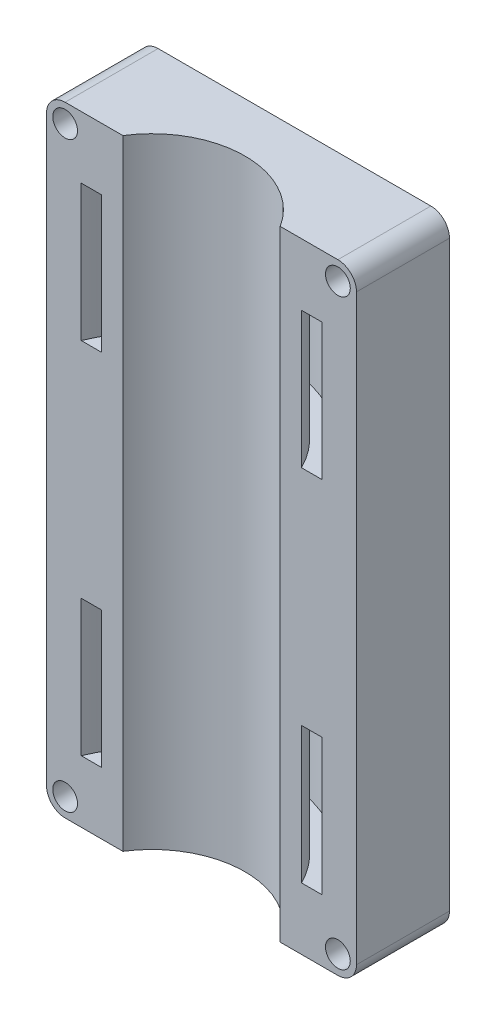
ISO-10303-21;
HEADER;
FILE_DESCRIPTION(('STEP AP214'),'2;1');
FILE_NAME('part.step','',(''),(''),'','','');
FILE_SCHEMA(('AUTOMOTIVE_DESIGN { 1 0 10303 214 1 1 1 1 }'));
ENDSEC;
DATA;
#1=APPLICATION_CONTEXT('core data for automotive mechanical design processes');
#2=APPLICATION_PROTOCOL_DEFINITION('international standard','automotive_design',2000,#1);
#3=PRODUCT_CONTEXT('',#1,'mechanical');
#4=PRODUCT('Part','Part','',(#3));
#5=PRODUCT_RELATED_PRODUCT_CATEGORY('part','',(#4));
#6=PRODUCT_DEFINITION_FORMATION('','',#4);
#7=PRODUCT_DEFINITION_CONTEXT('part definition',#1,'design');
#8=PRODUCT_DEFINITION('design','',#6,#7);
#9=PRODUCT_DEFINITION_SHAPE('','',#8);
#10=(LENGTH_UNIT() NAMED_UNIT(*) SI_UNIT(.MILLI.,.METRE.));
#11=(NAMED_UNIT(*) PLANE_ANGLE_UNIT() SI_UNIT($,.RADIAN.));
#12=(NAMED_UNIT(*) SI_UNIT($,.STERADIAN.) SOLID_ANGLE_UNIT());
#13=UNCERTAINTY_MEASURE_WITH_UNIT(LENGTH_MEASURE(1.E-05),#10,'distance_accuracy_value','');
#14=(GEOMETRIC_REPRESENTATION_CONTEXT(3) GLOBAL_UNCERTAINTY_ASSIGNED_CONTEXT((#13)) GLOBAL_UNIT_ASSIGNED_CONTEXT((#10,
#11,#12)) REPRESENTATION_CONTEXT('',''));
#15=CARTESIAN_POINT('',(0.,0.,0.));
#16=DIRECTION('',(0.,0.,1.));
#17=DIRECTION('',(1.,0.,0.));
#18=AXIS2_PLACEMENT_3D('',#15,#16,#17);
#19=CARTESIAN_POINT('',(21.9929702359002,-47.0002235739537,15.));
#20=DIRECTION('',(0.,0.,1.));
#21=DIRECTION('',(1.,0.,0.));
#22=AXIS2_PLACEMENT_3D('',#19,#20,#21);
#23=PLANE('',#22);
#24=DIRECTION('',(0.,1.,0.));
#25=VECTOR('',#24,1.);
#26=CARTESIAN_POINT('',(12.6885775404495,-50.0002235739537,15.));
#27=LINE('',#26,#25);
#28=CARTESIAN_POINT('',(12.6885775404495,-50.0002235739537,15.));
#29=VERTEX_POINT('',#28);
#30=CARTESIAN_POINT('',(12.6885775404495,49.9997764260463,15.));
#31=VERTEX_POINT('',#30);
#32=EDGE_CURVE('E333',#29,#31,#27,.T.);
#33=ORIENTED_EDGE('',*,*,#32,.F.);
#34=DIRECTION('',(1.,0.,0.));
#35=VECTOR('',#34,1.);
#36=CARTESIAN_POINT('',(-22.0070297640998,-50.0002235739537,15.));
#37=LINE('',#36,#35);
#38=CARTESIAN_POINT('',(21.9929702359002,-50.0002235739537,15.));
#39=VERTEX_POINT('',#38);
#40=EDGE_CURVE('E386',#29,#39,#37,.T.);
#41=ORIENTED_EDGE('',*,*,#40,.T.);
#42=CARTESIAN_POINT('',(21.9929702359002,-47.0002235739537,15.));
#43=DIRECTION('',(0.,0.,1.));
#44=DIRECTION('',(1.,0.,0.));
#45=AXIS2_PLACEMENT_3D('',#42,#43,#44);
#46=CIRCLE('',#45,3.00000000000001);
#47=CARTESIAN_POINT('',(24.9929702359002,-47.0002235739537,15.));
#48=VERTEX_POINT('',#47);
#49=EDGE_CURVE('E364',#39,#48,#46,.T.);
#50=ORIENTED_EDGE('',*,*,#49,.T.);
#51=DIRECTION('',(0.,1.,0.));
#52=VECTOR('',#51,1.);
#53=CARTESIAN_POINT('',(24.9929702359002,-47.0002235739537,15.));
#54=LINE('',#53,#52);
#55=CARTESIAN_POINT('',(24.9929702359002,46.9997764260463,15.));
#56=VERTEX_POINT('',#55);
#57=EDGE_CURVE('E367',#48,#56,#54,.T.);
#58=ORIENTED_EDGE('',*,*,#57,.T.);
#59=CARTESIAN_POINT('',(21.9929702359002,46.9997764260463,15.));
#60=DIRECTION('',(0.,0.,-1.));
#61=DIRECTION('',(-1.,0.,0.));
#62=AXIS2_PLACEMENT_3D('',#59,#60,#61);
#63=CIRCLE('',#62,3.);
#64=CARTESIAN_POINT('',(21.9929702359002,49.9997764260463,15.));
#65=VERTEX_POINT('',#64);
#66=EDGE_CURVE('E370',#65,#56,#63,.T.);
#67=ORIENTED_EDGE('',*,*,#66,.F.);
#68=DIRECTION('',(1.,0.,0.));
#69=VECTOR('',#68,1.);
#70=CARTESIAN_POINT('',(-22.0070297640998,49.9997764260463,15.));
#71=LINE('',#70,#69);
#72=EDGE_CURVE('E373',#31,#65,#71,.T.);
#73=ORIENTED_EDGE('',*,*,#72,.F.);
#74=EDGE_LOOP('',(#33,#41,#50,#58,#67,#73));
#75=FACE_BOUND('',#74,.T.);
#76=CARTESIAN_POINT('',(21.9929702359002,46.9997764260463,15.));
#77=DIRECTION('',(0.,0.,1.));
#78=DIRECTION('',(1.,0.,0.));
#79=AXIS2_PLACEMENT_3D('',#76,#77,#78);
#80=CIRCLE('',#79,2.00000000000001);
#81=CARTESIAN_POINT('',(23.9929702359002,46.9997764260463,15.));
#82=VERTEX_POINT('',#81);
#83=EDGE_CURVE('E358',#82,#82,#80,.T.);
#84=ORIENTED_EDGE('',*,*,#83,.F.);
#85=EDGE_LOOP('',(#84));
#86=FACE_BOUND('',#85,.T.);
#87=CARTESIAN_POINT('',(21.9929702359002,-47.0002235739537,15.));
#88=DIRECTION('',(0.,0.,1.));
#89=DIRECTION('',(1.,0.,0.));
#90=AXIS2_PLACEMENT_3D('',#87,#88,#89);
#91=CIRCLE('',#90,2.00000000000001);
#92=CARTESIAN_POINT('',(23.9929702359002,-47.0002235739537,15.));
#93=VERTEX_POINT('',#92);
#94=EDGE_CURVE('E346',#93,#93,#91,.T.);
#95=ORIENTED_EDGE('',*,*,#94,.F.);
#96=EDGE_LOOP('',(#95));
#97=FACE_BOUND('',#96,.T.);
#98=DIRECTION('',(0.,1.,0.));
#99=VECTOR('',#98,1.);
#100=CARTESIAN_POINT('',(19.4164878389476,17.9997764260463,15.));
#101=LINE('',#100,#99);
#102=CARTESIAN_POINT('',(19.4164878389476,17.9997764260463,15.));
#103=VERTEX_POINT('',#102);
#104=CARTESIAN_POINT('',(19.4164878389476,39.9997764260463,15.));
#105=VERTEX_POINT('',#104);
#106=EDGE_CURVE('E308',#103,#105,#101,.T.);
#107=ORIENTED_EDGE('',*,*,#106,.F.);
#108=DIRECTION('',(1.,0.,0.));
#109=VECTOR('',#108,1.);
#110=CARTESIAN_POINT('',(0.,17.9997764260463,15.));
#111=LINE('',#110,#109);
#112=CARTESIAN_POINT('',(16.1245154965971,17.9997764260463,15.));
#113=VERTEX_POINT('',#112);
#114=EDGE_CURVE('E298',#113,#103,#111,.T.);
#115=ORIENTED_EDGE('',*,*,#114,.F.);
#116=DIRECTION('',(0.,1.,0.));
#117=VECTOR('',#116,1.);
#118=CARTESIAN_POINT('',(16.1245154965971,17.9997764260463,15.));
#119=LINE('',#118,#117);
#120=CARTESIAN_POINT('',(16.1245154965971,39.9997764260463,15.));
#121=VERTEX_POINT('',#120);
#122=EDGE_CURVE('E318',#113,#121,#119,.T.);
#123=ORIENTED_EDGE('',*,*,#122,.T.);
#124=DIRECTION('',(1.,0.,0.));
#125=VECTOR('',#124,1.);
#126=CARTESIAN_POINT('',(0.,39.9997764260463,15.));
#127=LINE('',#126,#125);
#128=EDGE_CURVE('E309',#121,#105,#127,.T.);
#129=ORIENTED_EDGE('',*,*,#128,.T.);
#130=EDGE_LOOP('',(#107,#115,#123,#129));
#131=FACE_BOUND('',#130,.T.);
#132=DIRECTION('',(0.,1.,0.));
#133=VECTOR('',#132,1.);
#134=CARTESIAN_POINT('',(19.4164878389476,-40.0002235739537,15.));
#135=LINE('',#134,#133);
#136=CARTESIAN_POINT('',(19.4164878389476,-40.0002235739537,15.));
#137=VERTEX_POINT('',#136);
#138=CARTESIAN_POINT('',(19.4164878389476,-18.0002235739537,15.));
#139=VERTEX_POINT('',#138);
#140=EDGE_CURVE('E274',#137,#139,#135,.T.);
#141=ORIENTED_EDGE('',*,*,#140,.F.);
#142=DIRECTION('',(1.,0.,0.));
#143=VECTOR('',#142,1.);
#144=CARTESIAN_POINT('',(0.,-40.0002235739537,15.));
#145=LINE('',#144,#143);
#146=CARTESIAN_POINT('',(16.1245154965971,-40.0002235739537,15.));
#147=VERTEX_POINT('',#146);
#148=EDGE_CURVE('E282',#147,#137,#145,.T.);
#149=ORIENTED_EDGE('',*,*,#148,.F.);
#150=DIRECTION('',(0.,1.,0.));
#151=VECTOR('',#150,1.);
#152=CARTESIAN_POINT('',(16.1245154965971,-40.0002235739537,15.));
#153=LINE('',#152,#151);
#154=CARTESIAN_POINT('',(16.1245154965971,-18.0002235739537,15.));
#155=VERTEX_POINT('',#154);
#156=EDGE_CURVE('E313',#147,#155,#153,.T.);
#157=ORIENTED_EDGE('',*,*,#156,.T.);
#158=DIRECTION('',(1.,0.,0.));
#159=VECTOR('',#158,1.);
#160=CARTESIAN_POINT('',(0.,-18.0002235739537,15.));
#161=LINE('',#160,#159);
#162=EDGE_CURVE('E291',#155,#139,#161,.T.);
#163=ORIENTED_EDGE('',*,*,#162,.T.);
#164=EDGE_LOOP('',(#141,#149,#157,#163));
#165=FACE_BOUND('',#164,.T.);
#166=ADVANCED_FACE('F147',(#75,#86,#97,#131,#165),#23,.T.);
#167=DIRECTION('',(0.,1.,0.));
#168=VECTOR('',#167,1.);
#169=CARTESIAN_POINT('',(-12.6885775404495,-50.0002235739537,15.));
#170=LINE('',#169,#168);
#171=CARTESIAN_POINT('',(-12.6885775404495,-50.0002235739537,15.));
#172=VERTEX_POINT('',#171);
#173=CARTESIAN_POINT('',(-12.6885775404495,49.9997764260463,15.));
#174=VERTEX_POINT('',#173);
#175=EDGE_CURVE('E335',#172,#174,#170,.T.);
#176=ORIENTED_EDGE('',*,*,#175,.T.);
#177=CARTESIAN_POINT('',(-22.0070297640998,49.9997764260463,15.));
#178=VERTEX_POINT('',#177);
#179=EDGE_CURVE('E374',#178,#174,#71,.T.);
#180=ORIENTED_EDGE('',*,*,#179,.F.);
#181=CARTESIAN_POINT('',(-22.0070297640998,46.9997764260463,15.));
#182=DIRECTION('',(0.,0.,-1.));
#183=DIRECTION('',(-1.,0.,0.));
#184=AXIS2_PLACEMENT_3D('',#181,#182,#183);
#185=CIRCLE('',#184,3.);
#186=CARTESIAN_POINT('',(-25.0070297640998,46.9997764260463,15.));
#187=VERTEX_POINT('',#186);
#188=EDGE_CURVE('E377',#187,#178,#185,.T.);
#189=ORIENTED_EDGE('',*,*,#188,.F.);
#190=DIRECTION('',(0.,1.,0.));
#191=VECTOR('',#190,1.);
#192=CARTESIAN_POINT('',(-25.0070297640998,-47.0002235739537,15.));
#193=LINE('',#192,#191);
#194=CARTESIAN_POINT('',(-25.0070297640998,-47.0002235739537,15.));
#195=VERTEX_POINT('',#194);
#196=EDGE_CURVE('E380',#195,#187,#193,.T.);
#197=ORIENTED_EDGE('',*,*,#196,.F.);
#198=CARTESIAN_POINT('',(-22.0070297640998,-47.0002235739537,15.));
#199=DIRECTION('',(0.,0.,-1.));
#200=DIRECTION('',(-1.,0.,0.));
#201=AXIS2_PLACEMENT_3D('',#198,#199,#200);
#202=CIRCLE('',#201,3.);
#203=CARTESIAN_POINT('',(-22.0070297640998,-50.0002235739537,15.));
#204=VERTEX_POINT('',#203);
#205=EDGE_CURVE('E383',#204,#195,#202,.T.);
#206=ORIENTED_EDGE('',*,*,#205,.F.);
#207=EDGE_CURVE('E387',#204,#172,#37,.T.);
#208=ORIENTED_EDGE('',*,*,#207,.T.);
#209=EDGE_LOOP('',(#176,#180,#189,#197,#206,#208));
#210=FACE_BOUND('',#209,.T.);
#211=CARTESIAN_POINT('',(-22.0070297640998,46.9997764260463,15.));
#212=DIRECTION('',(0.,0.,1.));
#213=DIRECTION('',(1.,0.,0.));
#214=AXIS2_PLACEMENT_3D('',#211,#212,#213);
#215=CIRCLE('',#214,2.);
#216=CARTESIAN_POINT('',(-20.0070297640998,46.9997764260463,15.));
#217=VERTEX_POINT('',#216);
#218=EDGE_CURVE('E352',#217,#217,#215,.T.);
#219=ORIENTED_EDGE('',*,*,#218,.F.);
#220=EDGE_LOOP('',(#219));
#221=FACE_BOUND('',#220,.T.);
#222=CARTESIAN_POINT('',(-22.0070297640998,-47.0002235739537,15.));
#223=DIRECTION('',(0.,0.,1.));
#224=DIRECTION('',(1.,0.,0.));
#225=AXIS2_PLACEMENT_3D('',#222,#223,#224);
#226=CIRCLE('',#225,2.);
#227=CARTESIAN_POINT('',(-20.0070297640998,-47.0002235739537,15.));
#228=VERTEX_POINT('',#227);
#229=EDGE_CURVE('E340',#228,#228,#226,.T.);
#230=ORIENTED_EDGE('',*,*,#229,.F.);
#231=EDGE_LOOP('',(#230));
#232=FACE_BOUND('',#231,.T.);
#233=DIRECTION('',(0.,1.,0.));
#234=VECTOR('',#233,1.);
#235=CARTESIAN_POINT('',(-16.1245154965971,17.9997764260463,15.));
#236=LINE('',#235,#234);
#237=CARTESIAN_POINT('',(-16.1245154965971,17.9997764260463,15.));
#238=VERTEX_POINT('',#237);
#239=CARTESIAN_POINT('',(-16.1245154965971,39.9997764260463,15.));
#240=VERTEX_POINT('',#239);
#241=EDGE_CURVE('E322',#238,#240,#236,.T.);
#242=ORIENTED_EDGE('',*,*,#241,.F.);
#243=CARTESIAN_POINT('',(-19.4164878389476,17.9997764260463,15.));
#244=VERTEX_POINT('',#243);
#245=EDGE_CURVE('E303',#244,#238,#111,.T.);
#246=ORIENTED_EDGE('',*,*,#245,.F.);
#247=DIRECTION('',(0.,1.,0.));
#248=VECTOR('',#247,1.);
#249=CARTESIAN_POINT('',(-19.4164878389476,17.9997764260463,15.));
#250=LINE('',#249,#248);
#251=CARTESIAN_POINT('',(-19.4164878389476,39.9997764260463,15.));
#252=VERTEX_POINT('',#251);
#253=EDGE_CURVE('E325',#244,#252,#250,.T.);
#254=ORIENTED_EDGE('',*,*,#253,.T.);
#255=EDGE_CURVE('E314',#252,#240,#127,.T.);
#256=ORIENTED_EDGE('',*,*,#255,.T.);
#257=EDGE_LOOP('',(#242,#246,#254,#256));
#258=FACE_BOUND('',#257,.T.);
#259=DIRECTION('',(0.,1.,0.));
#260=VECTOR('',#259,1.);
#261=CARTESIAN_POINT('',(-16.1245154965971,-40.0002235739537,15.));
#262=LINE('',#261,#260);
#263=CARTESIAN_POINT('',(-16.1245154965971,-40.0002235739537,15.));
#264=VERTEX_POINT('',#263);
#265=CARTESIAN_POINT('',(-16.1245154965971,-18.0002235739537,15.));
#266=VERTEX_POINT('',#265);
#267=EDGE_CURVE('E293',#264,#266,#262,.T.);
#268=ORIENTED_EDGE('',*,*,#267,.F.);
#269=CARTESIAN_POINT('',(-19.4164878389476,-40.0002235739537,15.));
#270=VERTEX_POINT('',#269);
#271=EDGE_CURVE('E281',#270,#264,#145,.T.);
#272=ORIENTED_EDGE('',*,*,#271,.F.);
#273=DIRECTION('',(0.,1.,0.));
#274=VECTOR('',#273,1.);
#275=CARTESIAN_POINT('',(-19.4164878389476,-40.0002235739537,15.));
#276=LINE('',#275,#274);
#277=CARTESIAN_POINT('',(-19.4164878389476,-18.0002235739537,15.));
#278=VERTEX_POINT('',#277);
#279=EDGE_CURVE('E277',#270,#278,#276,.T.);
#280=ORIENTED_EDGE('',*,*,#279,.T.);
#281=EDGE_CURVE('E702',#278,#266,#161,.T.);
#282=ORIENTED_EDGE('',*,*,#281,.T.);
#283=EDGE_LOOP('',(#268,#272,#280,#282));
#284=FACE_BOUND('',#283,.T.);
#285=ADVANCED_FACE('F465',(#210,#221,#232,#258,#284),#23,.T.);
#286=CARTESIAN_POINT('',(21.9929702359002,-47.0002235739537,0.));
#287=DIRECTION('',(0.,0.,1.));
#288=DIRECTION('',(1.,0.,0.));
#289=AXIS2_PLACEMENT_3D('',#286,#287,#288);
#290=PLANE('',#289);
#291=CARTESIAN_POINT('',(21.9929702359002,-47.0002235739537,0.));
#292=DIRECTION('',(0.,0.,1.));
#293=DIRECTION('',(1.,0.,0.));
#294=AXIS2_PLACEMENT_3D('',#291,#292,#293);
#295=CIRCLE('',#294,3.00000000000001);
#296=CARTESIAN_POINT('',(21.9929702359002,-50.0002235739537,0.));
#297=VERTEX_POINT('',#296);
#298=CARTESIAN_POINT('',(24.9929702359002,-47.0002235739537,0.));
#299=VERTEX_POINT('',#298);
#300=EDGE_CURVE('E361',#297,#299,#295,.T.);
#301=ORIENTED_EDGE('',*,*,#300,.F.);
#302=DIRECTION('',(1.,0.,0.));
#303=VECTOR('',#302,1.);
#304=CARTESIAN_POINT('',(-22.0070297640998,-50.0002235739537,0.));
#305=LINE('',#304,#303);
#306=CARTESIAN_POINT('',(-22.0070297640998,-50.0002235739537,0.));
#307=VERTEX_POINT('',#306);
#308=EDGE_CURVE('E368',#307,#297,#305,.T.);
#309=ORIENTED_EDGE('',*,*,#308,.F.);
#310=CARTESIAN_POINT('',(-22.0070297640998,-47.0002235739537,0.));
#311=DIRECTION('',(0.,0.,-1.));
#312=DIRECTION('',(-1.,0.,0.));
#313=AXIS2_PLACEMENT_3D('',#310,#311,#312);
#314=CIRCLE('',#313,3.);
#315=CARTESIAN_POINT('',(-25.0070297640998,-47.0002235739537,0.));
#316=VERTEX_POINT('',#315);
#317=EDGE_CURVE('E408',#307,#316,#314,.T.);
#318=ORIENTED_EDGE('',*,*,#317,.T.);
#319=DIRECTION('',(0.,1.,0.));
#320=VECTOR('',#319,1.);
#321=CARTESIAN_POINT('',(-25.0070297640998,-47.0002235739537,0.));
#322=LINE('',#321,#320);
#323=CARTESIAN_POINT('',(-25.0070297640998,46.9997764260463,0.));
#324=VERTEX_POINT('',#323);
#325=EDGE_CURVE('E405',#316,#324,#322,.T.);
#326=ORIENTED_EDGE('',*,*,#325,.T.);
#327=CARTESIAN_POINT('',(-22.0070297640998,46.9997764260463,0.));
#328=DIRECTION('',(0.,0.,-1.));
#329=DIRECTION('',(-1.,0.,0.));
#330=AXIS2_PLACEMENT_3D('',#327,#328,#329);
#331=CIRCLE('',#330,3.);
#332=CARTESIAN_POINT('',(-22.0070297640998,49.9997764260463,0.));
#333=VERTEX_POINT('',#332);
#334=EDGE_CURVE('E402',#324,#333,#331,.T.);
#335=ORIENTED_EDGE('',*,*,#334,.T.);
#336=DIRECTION('',(1.,0.,0.));
#337=VECTOR('',#336,1.);
#338=CARTESIAN_POINT('',(-22.0070297640998,49.9997764260463,0.));
#339=LINE('',#338,#337);
#340=CARTESIAN_POINT('',(21.9929702359002,49.9997764260463,0.));
#341=VERTEX_POINT('',#340);
#342=EDGE_CURVE('E399',#333,#341,#339,.T.);
#343=ORIENTED_EDGE('',*,*,#342,.T.);
#344=CARTESIAN_POINT('',(21.9929702359002,46.9997764260463,0.));
#345=DIRECTION('',(0.,0.,-1.));
#346=DIRECTION('',(-1.,0.,0.));
#347=AXIS2_PLACEMENT_3D('',#344,#345,#346);
#348=CIRCLE('',#347,3.);
#349=CARTESIAN_POINT('',(24.9929702359002,46.9997764260463,0.));
#350=VERTEX_POINT('',#349);
#351=EDGE_CURVE('E396',#341,#350,#348,.T.);
#352=ORIENTED_EDGE('',*,*,#351,.T.);
#353=DIRECTION('',(0.,1.,0.));
#354=VECTOR('',#353,1.);
#355=CARTESIAN_POINT('',(24.9929702359002,-47.0002235739537,0.));
#356=LINE('',#355,#354);
#357=EDGE_CURVE('E393',#299,#350,#356,.T.);
#358=ORIENTED_EDGE('',*,*,#357,.F.);
#359=EDGE_LOOP('',(#301,#309,#318,#326,#335,#343,#352,#358));
#360=FACE_BOUND('',#359,.T.);
#361=CARTESIAN_POINT('',(21.9929702359002,46.9997764260463,0.));
#362=DIRECTION('',(0.,0.,1.));
#363=DIRECTION('',(1.,0.,0.));
#364=AXIS2_PLACEMENT_3D('',#361,#362,#363);
#365=CIRCLE('',#364,2.00000000000001);
#366=CARTESIAN_POINT('',(23.9929702359002,46.9997764260463,0.));
#367=VERTEX_POINT('',#366);
#368=EDGE_CURVE('E355',#367,#367,#365,.T.);
#369=ORIENTED_EDGE('',*,*,#368,.T.);
#370=EDGE_LOOP('',(#369));
#371=FACE_BOUND('',#370,.T.);
#372=CARTESIAN_POINT('',(-22.0070297640998,46.9997764260463,0.));
#373=DIRECTION('',(0.,0.,1.));
#374=DIRECTION('',(1.,0.,0.));
#375=AXIS2_PLACEMENT_3D('',#372,#373,#374);
#376=CIRCLE('',#375,2.);
#377=CARTESIAN_POINT('',(-20.0070297640998,46.9997764260463,0.));
#378=VERTEX_POINT('',#377);
#379=EDGE_CURVE('E349',#378,#378,#376,.T.);
#380=ORIENTED_EDGE('',*,*,#379,.T.);
#381=EDGE_LOOP('',(#380));
#382=FACE_BOUND('',#381,.T.);
#383=CARTESIAN_POINT('',(21.9929702359002,-47.0002235739537,0.));
#384=DIRECTION('',(0.,0.,1.));
#385=DIRECTION('',(1.,0.,0.));
#386=AXIS2_PLACEMENT_3D('',#383,#384,#385);
#387=CIRCLE('',#386,2.00000000000001);
#388=CARTESIAN_POINT('',(23.9929702359002,-47.0002235739537,0.));
#389=VERTEX_POINT('',#388);
#390=EDGE_CURVE('E343',#389,#389,#387,.T.);
#391=ORIENTED_EDGE('',*,*,#390,.T.);
#392=EDGE_LOOP('',(#391));
#393=FACE_BOUND('',#392,.T.);
#394=CARTESIAN_POINT('',(-22.0070297640998,-47.0002235739537,0.));
#395=DIRECTION('',(0.,0.,1.));
#396=DIRECTION('',(1.,0.,0.));
#397=AXIS2_PLACEMENT_3D('',#394,#395,#396);
#398=CIRCLE('',#397,2.);
#399=CARTESIAN_POINT('',(-20.0070297640998,-47.0002235739537,0.));
#400=VERTEX_POINT('',#399);
#401=EDGE_CURVE('E338',#400,#400,#398,.T.);
#402=ORIENTED_EDGE('',*,*,#401,.T.);
#403=EDGE_LOOP('',(#402));
#404=FACE_BOUND('',#403,.T.);
#405=ADVANCED_FACE('F434',(#360,#371,#382,#393,#404),#290,.F.);
#406=CARTESIAN_POINT('',(21.9929702359002,-47.0002235739537,15.));
#407=DIRECTION('',(0.,0.,-1.));
#408=DIRECTION('',(-1.,0.,0.));
#409=AXIS2_PLACEMENT_3D('',#406,#407,#408);
#410=CYLINDRICAL_SURFACE('',#409,3.00000000000001);
#411=ORIENTED_EDGE('',*,*,#300,.T.);
#412=DIRECTION('',(0.,0.,-1.));
#413=VECTOR('',#412,1.);
#414=CARTESIAN_POINT('',(24.9929702359002,-47.0002235739537,15.));
#415=LINE('',#414,#413);
#416=EDGE_CURVE('E12',#48,#299,#415,.T.);
#417=ORIENTED_EDGE('',*,*,#416,.F.);
#418=ORIENTED_EDGE('',*,*,#49,.F.);
#419=DIRECTION('',(0.,0.,-1.));
#420=VECTOR('',#419,1.);
#421=CARTESIAN_POINT('',(21.9929702359002,-50.0002235739537,15.));
#422=LINE('',#421,#420);
#423=EDGE_CURVE('E390',#39,#297,#422,.T.);
#424=ORIENTED_EDGE('',*,*,#423,.T.);
#425=EDGE_LOOP('',(#411,#417,#418,#424));
#426=FACE_BOUND('',#425,.T.);
#427=ADVANCED_FACE('F149',(#426),#410,.T.);
#428=CARTESIAN_POINT('',(24.9929702359002,-47.0002235739537,15.));
#429=DIRECTION('',(-1.,0.,0.));
#430=DIRECTION('',(0.,0.,1.));
#431=AXIS2_PLACEMENT_3D('',#428,#429,#430);
#432=PLANE('',#431);
#433=ORIENTED_EDGE('',*,*,#357,.T.);
#434=DIRECTION('',(0.,0.,-1.));
#435=VECTOR('',#434,1.);
#436=CARTESIAN_POINT('',(24.9929702359002,46.9997764260463,15.));
#437=LINE('',#436,#435);
#438=EDGE_CURVE('E155',#56,#350,#437,.T.);
#439=ORIENTED_EDGE('',*,*,#438,.F.);
#440=ORIENTED_EDGE('',*,*,#57,.F.);
#441=ORIENTED_EDGE('',*,*,#416,.T.);
#442=EDGE_LOOP('',(#433,#439,#440,#441));
#443=FACE_BOUND('',#442,.T.);
#444=ADVANCED_FACE('F430',(#443),#432,.F.);
#445=CARTESIAN_POINT('',(21.9929702359002,46.9997764260463,15.));
#446=DIRECTION('',(0.,0.,-1.));
#447=DIRECTION('',(-1.,0.,0.));
#448=AXIS2_PLACEMENT_3D('',#445,#446,#447);
#449=CYLINDRICAL_SURFACE('',#448,3.);
#450=ORIENTED_EDGE('',*,*,#351,.F.);
#451=DIRECTION('',(0.,0.,-1.));
#452=VECTOR('',#451,1.);
#453=CARTESIAN_POINT('',(21.9929702359002,49.9997764260463,15.));
#454=LINE('',#453,#452);
#455=EDGE_CURVE('E422',#65,#341,#454,.T.);
#456=ORIENTED_EDGE('',*,*,#455,.F.);
#457=ORIENTED_EDGE('',*,*,#66,.T.);
#458=ORIENTED_EDGE('',*,*,#438,.T.);
#459=EDGE_LOOP('',(#450,#456,#457,#458));
#460=FACE_BOUND('',#459,.T.);
#461=ADVANCED_FACE('F426',(#460),#449,.T.);
#462=CARTESIAN_POINT('',(-22.0070297640998,49.9997764260463,15.));
#463=DIRECTION('',(0.,1.,0.));
#464=DIRECTION('',(0.,0.,1.));
#465=AXIS2_PLACEMENT_3D('',#462,#463,#464);
#466=PLANE('',#465);
#467=CARTESIAN_POINT('',(0.,49.9997764260463,23.));
#468=DIRECTION('',(0.,1.,0.));
#469=DIRECTION('',(0.,0.,1.));
#470=AXIS2_PLACEMENT_3D('',#467,#468,#469);
#471=CIRCLE('',#470,15.);
#472=EDGE_CURVE('E321',#31,#174,#471,.T.);
#473=ORIENTED_EDGE('',*,*,#472,.F.);
#474=ORIENTED_EDGE('',*,*,#72,.T.);
#475=ORIENTED_EDGE('',*,*,#455,.T.);
#476=ORIENTED_EDGE('',*,*,#342,.F.);
#477=DIRECTION('',(0.,0.,-1.));
#478=VECTOR('',#477,1.);
#479=CARTESIAN_POINT('',(-22.0070297640998,49.9997764260463,15.));
#480=LINE('',#479,#478);
#481=EDGE_CURVE('E420',#178,#333,#480,.T.);
#482=ORIENTED_EDGE('',*,*,#481,.F.);
#483=ORIENTED_EDGE('',*,*,#179,.T.);
#484=EDGE_LOOP('',(#473,#474,#475,#476,#482,#483));
#485=FACE_BOUND('',#484,.T.);
#486=ADVANCED_FACE('F440',(#485),#466,.T.);
#487=CARTESIAN_POINT('',(-22.0070297640998,46.9997764260463,15.));
#488=DIRECTION('',(0.,0.,-1.));
#489=DIRECTION('',(-1.,0.,0.));
#490=AXIS2_PLACEMENT_3D('',#487,#488,#489);
#491=CYLINDRICAL_SURFACE('',#490,3.);
#492=ORIENTED_EDGE('',*,*,#334,.F.);
#493=DIRECTION('',(0.,0.,-1.));
#494=VECTOR('',#493,1.);
#495=CARTESIAN_POINT('',(-25.0070297640998,46.9997764260463,15.));
#496=LINE('',#495,#494);
#497=EDGE_CURVE('E418',#187,#324,#496,.T.);
#498=ORIENTED_EDGE('',*,*,#497,.F.);
#499=ORIENTED_EDGE('',*,*,#188,.T.);
#500=ORIENTED_EDGE('',*,*,#481,.T.);
#501=EDGE_LOOP('',(#492,#498,#499,#500));
#502=FACE_BOUND('',#501,.T.);
#503=ADVANCED_FACE('F463',(#502),#491,.T.);
#504=CARTESIAN_POINT('',(-25.0070297640998,-47.0002235739537,15.));
#505=DIRECTION('',(-1.,0.,0.));
#506=DIRECTION('',(0.,0.,1.));
#507=AXIS2_PLACEMENT_3D('',#504,#505,#506);
#508=PLANE('',#507);
#509=ORIENTED_EDGE('',*,*,#325,.F.);
#510=DIRECTION('',(0.,0.,-1.));
#511=VECTOR('',#510,1.);
#512=CARTESIAN_POINT('',(-25.0070297640998,-47.0002235739537,15.));
#513=LINE('',#512,#511);
#514=EDGE_CURVE('E416',#195,#316,#513,.T.);
#515=ORIENTED_EDGE('',*,*,#514,.F.);
#516=ORIENTED_EDGE('',*,*,#196,.T.);
#517=ORIENTED_EDGE('',*,*,#497,.T.);
#518=EDGE_LOOP('',(#509,#515,#516,#517));
#519=FACE_BOUND('',#518,.T.);
#520=ADVANCED_FACE('F460',(#519),#508,.T.);
#521=CARTESIAN_POINT('',(-22.0070297640998,-47.0002235739537,15.));
#522=DIRECTION('',(0.,0.,-1.));
#523=DIRECTION('',(-1.,0.,0.));
#524=AXIS2_PLACEMENT_3D('',#521,#522,#523);
#525=CYLINDRICAL_SURFACE('',#524,3.);
#526=ORIENTED_EDGE('',*,*,#317,.F.);
#527=DIRECTION('',(0.,0.,-1.));
#528=VECTOR('',#527,1.);
#529=CARTESIAN_POINT('',(-22.0070297640998,-50.0002235739537,15.));
#530=LINE('',#529,#528);
#531=EDGE_CURVE('E414',#204,#307,#530,.T.);
#532=ORIENTED_EDGE('',*,*,#531,.F.);
#533=ORIENTED_EDGE('',*,*,#205,.T.);
#534=ORIENTED_EDGE('',*,*,#514,.T.);
#535=EDGE_LOOP('',(#526,#532,#533,#534));
#536=FACE_BOUND('',#535,.T.);
#537=ADVANCED_FACE('F454',(#536),#525,.T.);
#538=CARTESIAN_POINT('',(-22.0070297640998,-50.0002235739537,15.));
#539=DIRECTION('',(0.,1.,0.));
#540=DIRECTION('',(-1.,0.,0.));
#541=AXIS2_PLACEMENT_3D('',#538,#539,#540);
#542=PLANE('',#541);
#543=ORIENTED_EDGE('',*,*,#40,.F.);
#544=CARTESIAN_POINT('',(0.,-50.0002235739537,23.));
#545=DIRECTION('',(0.,1.,0.));
#546=DIRECTION('',(0.,0.,1.));
#547=AXIS2_PLACEMENT_3D('',#544,#545,#546);
#548=CIRCLE('',#547,15.);
#549=EDGE_CURVE('E330',#29,#172,#548,.T.);
#550=ORIENTED_EDGE('',*,*,#549,.T.);
#551=ORIENTED_EDGE('',*,*,#207,.F.);
#552=ORIENTED_EDGE('',*,*,#531,.T.);
#553=ORIENTED_EDGE('',*,*,#308,.T.);
#554=ORIENTED_EDGE('',*,*,#423,.F.);
#555=EDGE_LOOP('',(#543,#550,#551,#552,#553,#554));
#556=FACE_BOUND('',#555,.T.);
#557=ADVANCED_FACE('F469',(#556),#542,.F.);
#558=CARTESIAN_POINT('',(21.9929702359002,46.9997764260463,15.));
#559=DIRECTION('',(0.,0.,-1.));
#560=DIRECTION('',(-1.,0.,0.));
#561=AXIS2_PLACEMENT_3D('',#558,#559,#560);
#562=CYLINDRICAL_SURFACE('',#561,2.00000000000001);
#563=ORIENTED_EDGE('',*,*,#83,.T.);
#564=EDGE_LOOP('',(#563));
#565=FACE_BOUND('',#564,.T.);
#566=ORIENTED_EDGE('',*,*,#368,.F.);
#567=EDGE_LOOP('',(#566));
#568=FACE_BOUND('',#567,.T.);
#569=ADVANCED_FACE('F471',(#565,#568),#562,.F.);
#570=CARTESIAN_POINT('',(-22.0070297640998,46.9997764260463,15.));
#571=DIRECTION('',(0.,0.,-1.));
#572=DIRECTION('',(-1.,0.,0.));
#573=AXIS2_PLACEMENT_3D('',#570,#571,#572);
#574=CYLINDRICAL_SURFACE('',#573,2.);
#575=ORIENTED_EDGE('',*,*,#218,.T.);
#576=EDGE_LOOP('',(#575));
#577=FACE_BOUND('',#576,.T.);
#578=ORIENTED_EDGE('',*,*,#379,.F.);
#579=EDGE_LOOP('',(#578));
#580=FACE_BOUND('',#579,.T.);
#581=ADVANCED_FACE('F478',(#577,#580),#574,.F.);
#582=CARTESIAN_POINT('',(21.9929702359002,-47.0002235739537,15.));
#583=DIRECTION('',(0.,0.,-1.));
#584=DIRECTION('',(-1.,0.,0.));
#585=AXIS2_PLACEMENT_3D('',#582,#583,#584);
#586=CYLINDRICAL_SURFACE('',#585,2.00000000000001);
#587=ORIENTED_EDGE('',*,*,#94,.T.);
#588=EDGE_LOOP('',(#587));
#589=FACE_BOUND('',#588,.T.);
#590=ORIENTED_EDGE('',*,*,#390,.F.);
#591=EDGE_LOOP('',(#590));
#592=FACE_BOUND('',#591,.T.);
#593=ADVANCED_FACE('F528',(#589,#592),#586,.F.);
#594=CARTESIAN_POINT('',(-22.0070297640998,-47.0002235739537,15.));
#595=DIRECTION('',(0.,0.,-1.));
#596=DIRECTION('',(-1.,0.,0.));
#597=AXIS2_PLACEMENT_3D('',#594,#595,#596);
#598=CYLINDRICAL_SURFACE('',#597,2.);
#599=ORIENTED_EDGE('',*,*,#229,.T.);
#600=EDGE_LOOP('',(#599));
#601=FACE_BOUND('',#600,.T.);
#602=ORIENTED_EDGE('',*,*,#401,.F.);
#603=EDGE_LOOP('',(#602));
#604=FACE_BOUND('',#603,.T.);
#605=ADVANCED_FACE('F536',(#601,#604),#598,.F.);
#606=CARTESIAN_POINT('',(0.,-50.0002235739537,23.));
#607=DIRECTION('',(0.,1.,0.));
#608=DIRECTION('',(0.,0.,1.));
#609=AXIS2_PLACEMENT_3D('',#606,#607,#608);
#610=CYLINDRICAL_SURFACE('',#609,15.);
#611=ORIENTED_EDGE('',*,*,#472,.T.);
#612=ORIENTED_EDGE('',*,*,#175,.F.);
#613=ORIENTED_EDGE('',*,*,#549,.F.);
#614=ORIENTED_EDGE('',*,*,#32,.T.);
#615=EDGE_LOOP('',(#611,#612,#613,#614));
#616=FACE_BOUND('',#615,.T.);
#617=ADVANCED_FACE('F468',(#616),#610,.F.);
#618=CARTESIAN_POINT('',(0.,17.9997764260463,23.));
#619=DIRECTION('',(0.,1.,0.));
#620=DIRECTION('',(0.,0.,1.));
#621=AXIS2_PLACEMENT_3D('',#618,#619,#620);
#622=CYLINDRICAL_SURFACE('',#621,18.);
#623=CARTESIAN_POINT('',(0.,39.9997764260463,23.));
#624=DIRECTION('',(0.,1.,0.));
#625=DIRECTION('',(0.,0.,1.));
#626=AXIS2_PLACEMENT_3D('',#623,#624,#625);
#627=CIRCLE('',#626,18.);
#628=EDGE_CURVE('E302',#121,#240,#627,.T.);
#629=ORIENTED_EDGE('',*,*,#628,.F.);
#630=ORIENTED_EDGE('',*,*,#122,.F.);
#631=CARTESIAN_POINT('',(0.,17.9997764260463,23.));
#632=DIRECTION('',(0.,1.,0.));
#633=DIRECTION('',(0.,0.,1.));
#634=AXIS2_PLACEMENT_3D('',#631,#632,#633);
#635=CIRCLE('',#634,18.);
#636=EDGE_CURVE('E306',#113,#238,#635,.T.);
#637=ORIENTED_EDGE('',*,*,#636,.T.);
#638=ORIENTED_EDGE('',*,*,#241,.T.);
#639=EDGE_LOOP('',(#629,#630,#637,#638));
#640=FACE_BOUND('',#639,.T.);
#641=ADVANCED_FACE('F577',(#640),#622,.T.);
#642=CARTESIAN_POINT('',(0.,17.9997764260463,23.));
#643=DIRECTION('',(0.,1.,0.));
#644=DIRECTION('',(0.,0.,1.));
#645=AXIS2_PLACEMENT_3D('',#642,#643,#644);
#646=CYLINDRICAL_SURFACE('',#645,21.);
#647=CARTESIAN_POINT('',(0.,39.9997764260463,23.));
#648=DIRECTION('',(0.,1.,0.));
#649=DIRECTION('',(0.,0.,1.));
#650=AXIS2_PLACEMENT_3D('',#647,#648,#649);
#651=CIRCLE('',#650,21.);
#652=EDGE_CURVE('E312',#105,#252,#651,.T.);
#653=ORIENTED_EDGE('',*,*,#652,.T.);
#654=ORIENTED_EDGE('',*,*,#253,.F.);
#655=CARTESIAN_POINT('',(0.,17.9997764260463,23.));
#656=DIRECTION('',(0.,1.,0.));
#657=DIRECTION('',(0.,0.,1.));
#658=AXIS2_PLACEMENT_3D('',#655,#656,#657);
#659=CIRCLE('',#658,21.);
#660=EDGE_CURVE('E301',#103,#244,#659,.T.);
#661=ORIENTED_EDGE('',*,*,#660,.F.);
#662=ORIENTED_EDGE('',*,*,#106,.T.);
#663=EDGE_LOOP('',(#653,#654,#661,#662));
#664=FACE_BOUND('',#663,.T.);
#665=ADVANCED_FACE('F585',(#664),#646,.F.);
#666=CARTESIAN_POINT('',(0.,17.9997764260463,0.));
#667=DIRECTION('',(0.,1.,0.));
#668=DIRECTION('',(0.,0.,1.));
#669=AXIS2_PLACEMENT_3D('',#666,#667,#668);
#670=PLANE('',#669);
#671=ORIENTED_EDGE('',*,*,#114,.T.);
#672=ORIENTED_EDGE('',*,*,#660,.T.);
#673=ORIENTED_EDGE('',*,*,#245,.T.);
#674=ORIENTED_EDGE('',*,*,#636,.F.);
#675=EDGE_LOOP('',(#671,#672,#673,#674));
#676=FACE_BOUND('',#675,.T.);
#677=ADVANCED_FACE('F594',(#676),#670,.T.);
#678=CARTESIAN_POINT('',(0.,39.9997764260463,0.));
#679=DIRECTION('',(0.,1.,0.));
#680=DIRECTION('',(0.,0.,1.));
#681=AXIS2_PLACEMENT_3D('',#678,#679,#680);
#682=PLANE('',#681);
#683=ORIENTED_EDGE('',*,*,#128,.F.);
#684=ORIENTED_EDGE('',*,*,#628,.T.);
#685=ORIENTED_EDGE('',*,*,#255,.F.);
#686=ORIENTED_EDGE('',*,*,#652,.F.);
#687=EDGE_LOOP('',(#683,#684,#685,#686));
#688=FACE_BOUND('',#687,.T.);
#689=ADVANCED_FACE('F603',(#688),#682,.F.);
#690=CARTESIAN_POINT('',(0.,-40.0002235739537,23.));
#691=DIRECTION('',(0.,1.,0.));
#692=DIRECTION('',(0.,0.,1.));
#693=AXIS2_PLACEMENT_3D('',#690,#691,#692);
#694=CYLINDRICAL_SURFACE('',#693,18.);
#695=CARTESIAN_POINT('',(0.,-18.0002235739537,23.));
#696=DIRECTION('',(0.,1.,0.));
#697=DIRECTION('',(0.,0.,1.));
#698=AXIS2_PLACEMENT_3D('',#695,#696,#697);
#699=CIRCLE('',#698,18.);
#700=EDGE_CURVE('E167',#155,#266,#699,.T.);
#701=ORIENTED_EDGE('',*,*,#700,.F.);
#702=ORIENTED_EDGE('',*,*,#156,.F.);
#703=CARTESIAN_POINT('',(0.,-40.0002235739537,23.));
#704=DIRECTION('',(0.,1.,0.));
#705=DIRECTION('',(0.,0.,1.));
#706=AXIS2_PLACEMENT_3D('',#703,#704,#705);
#707=CIRCLE('',#706,18.);
#708=EDGE_CURVE('E287',#147,#264,#707,.T.);
#709=ORIENTED_EDGE('',*,*,#708,.T.);
#710=ORIENTED_EDGE('',*,*,#267,.T.);
#711=EDGE_LOOP('',(#701,#702,#709,#710));
#712=FACE_BOUND('',#711,.T.);
#713=ADVANCED_FACE('F611',(#712),#694,.T.);
#714=CARTESIAN_POINT('',(0.,-40.0002235739537,23.));
#715=DIRECTION('',(0.,1.,0.));
#716=DIRECTION('',(0.,0.,1.));
#717=AXIS2_PLACEMENT_3D('',#714,#715,#716);
#718=CYLINDRICAL_SURFACE('',#717,21.);
#719=CARTESIAN_POINT('',(0.,-18.0002235739537,23.));
#720=DIRECTION('',(0.,1.,0.));
#721=DIRECTION('',(0.,0.,1.));
#722=AXIS2_PLACEMENT_3D('',#719,#720,#721);
#723=CIRCLE('',#722,21.);
#724=EDGE_CURVE('E162',#139,#278,#723,.T.);
#725=ORIENTED_EDGE('',*,*,#724,.T.);
#726=ORIENTED_EDGE('',*,*,#279,.F.);
#727=CARTESIAN_POINT('',(0.,-40.0002235739537,23.));
#728=DIRECTION('',(0.,1.,0.));
#729=DIRECTION('',(0.,0.,1.));
#730=AXIS2_PLACEMENT_3D('',#727,#728,#729);
#731=CIRCLE('',#730,21.);
#732=EDGE_CURVE('E270',#137,#270,#731,.T.);
#733=ORIENTED_EDGE('',*,*,#732,.F.);
#734=ORIENTED_EDGE('',*,*,#140,.T.);
#735=EDGE_LOOP('',(#725,#726,#733,#734));
#736=FACE_BOUND('',#735,.T.);
#737=ADVANCED_FACE('F272',(#736),#718,.F.);
#738=CARTESIAN_POINT('',(0.,-40.0002235739537,0.));
#739=DIRECTION('',(0.,1.,0.));
#740=DIRECTION('',(0.,0.,1.));
#741=AXIS2_PLACEMENT_3D('',#738,#739,#740);
#742=PLANE('',#741);
#743=ORIENTED_EDGE('',*,*,#148,.T.);
#744=ORIENTED_EDGE('',*,*,#732,.T.);
#745=ORIENTED_EDGE('',*,*,#271,.T.);
#746=ORIENTED_EDGE('',*,*,#708,.F.);
#747=EDGE_LOOP('',(#743,#744,#745,#746));
#748=FACE_BOUND('',#747,.T.);
#749=ADVANCED_FACE('F286',(#748),#742,.T.);
#750=CARTESIAN_POINT('',(0.,-18.0002235739537,0.));
#751=DIRECTION('',(0.,1.,0.));
#752=DIRECTION('',(0.,0.,1.));
#753=AXIS2_PLACEMENT_3D('',#750,#751,#752);
#754=PLANE('',#753);
#755=ORIENTED_EDGE('',*,*,#162,.F.);
#756=ORIENTED_EDGE('',*,*,#700,.T.);
#757=ORIENTED_EDGE('',*,*,#281,.F.);
#758=ORIENTED_EDGE('',*,*,#724,.F.);
#759=EDGE_LOOP('',(#755,#756,#757,#758));
#760=FACE_BOUND('',#759,.T.);
#761=ADVANCED_FACE('F646',(#760),#754,.F.);
#762=CLOSED_SHELL('',(#166,#285,#405,#427,#444,#461,#486,#503,#520,#537,#557,#569,#581,#593,
#605,#617,#641,#665,#677,#689,#713,#737,#749,#761));
#763=MANIFOLD_SOLID_BREP('B2',#762);
#764=ADVANCED_BREP_SHAPE_REPRESENTATION('',(#18,#763),#14);
#765=SHAPE_DEFINITION_REPRESENTATION(#9,#764);
ENDSEC;
END-ISO-10303-21;
